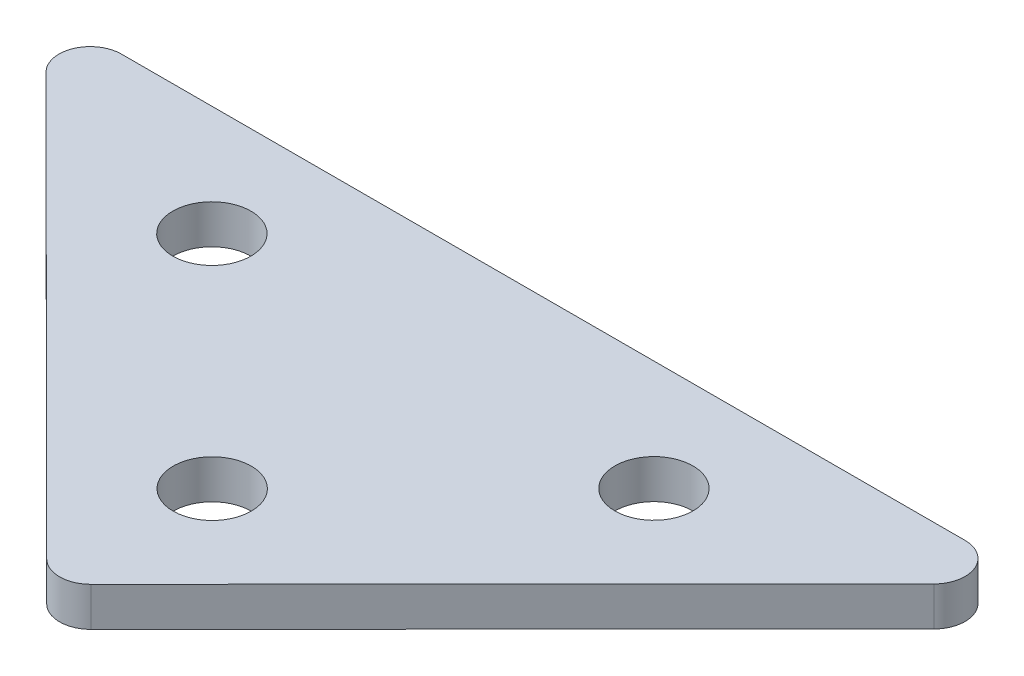
ISO-10303-21;
HEADER;
FILE_DESCRIPTION(('STEP AP214'),'2;1');
FILE_NAME('part.step','',(''),(''),'','','');
FILE_SCHEMA(('AUTOMOTIVE_DESIGN { 1 0 10303 214 1 1 1 1 }'));
ENDSEC;
DATA;
#1=APPLICATION_CONTEXT('core data for automotive mechanical design processes');
#2=APPLICATION_PROTOCOL_DEFINITION('international standard','automotive_design',2000,#1);
#3=PRODUCT_CONTEXT('',#1,'mechanical');
#4=PRODUCT('Part','Part','',(#3));
#5=PRODUCT_RELATED_PRODUCT_CATEGORY('part','',(#4));
#6=PRODUCT_DEFINITION_FORMATION('','',#4);
#7=PRODUCT_DEFINITION_CONTEXT('part definition',#1,'design');
#8=PRODUCT_DEFINITION('design','',#6,#7);
#9=PRODUCT_DEFINITION_SHAPE('','',#8);
#10=(LENGTH_UNIT() NAMED_UNIT(*) SI_UNIT(.MILLI.,.METRE.));
#11=(NAMED_UNIT(*) PLANE_ANGLE_UNIT() SI_UNIT($,.RADIAN.));
#12=(NAMED_UNIT(*) SI_UNIT($,.STERADIAN.) SOLID_ANGLE_UNIT());
#13=UNCERTAINTY_MEASURE_WITH_UNIT(LENGTH_MEASURE(1.E-05),#10,'distance_accuracy_value','');
#14=(GEOMETRIC_REPRESENTATION_CONTEXT(3) GLOBAL_UNCERTAINTY_ASSIGNED_CONTEXT((#13)) GLOBAL_UNIT_ASSIGNED_CONTEXT((#10,
#11,#12)) REPRESENTATION_CONTEXT('',''));
#15=CARTESIAN_POINT('',(0.,0.,0.));
#16=DIRECTION('',(0.,0.,1.));
#17=DIRECTION('',(1.,0.,0.));
#18=AXIS2_PLACEMENT_3D('',#15,#16,#17);
#19=CARTESIAN_POINT('',(141.656172869711,94.6333628767299,304.062793474049));
#20=DIRECTION('',(0.,-1.,0.));
#21=DIRECTION('',(1.,0.,0.));
#22=AXIS2_PLACEMENT_3D('',#19,#20,#21);
#23=PLANE('',#22);
#24=CARTESIAN_POINT('',(141.656172869711,94.6333628767299,304.062793474049));
#25=DIRECTION('',(0.,-1.,0.));
#26=DIRECTION('',(1.,0.,0.));
#27=AXIS2_PLACEMENT_3D('',#24,#25,#26);
#28=CIRCLE('',#27,2.54000000000001);
#29=CARTESIAN_POINT('',(139.861544625665,94.6333628767299,305.860266551921));
#30=VERTEX_POINT('',#29);
#31=CARTESIAN_POINT('',(141.654161268422,94.6333628767299,301.522794270612));
#32=VERTEX_POINT('',#31);
#33=EDGE_CURVE('E122',#30,#32,#28,.T.);
#34=ORIENTED_EDGE('',*,*,#33,.T.);
#35=DIRECTION('',(0.999999686392493,0.,-0.000791969011687206));
#36=VECTOR('',#35,1.);
#37=CARTESIAN_POINT('',(141.654161268422,94.6333628767299,301.522794270612));
#38=LINE('',#37,#36);
#39=CARTESIAN_POINT('',(210.212239960853,94.6333628767299,301.468498379759));
#40=VERTEX_POINT('',#39);
#41=EDGE_CURVE('E125',#32,#40,#38,.T.);
#42=ORIENTED_EDGE('',*,*,#41,.T.);
#43=CARTESIAN_POINT('',(210.214251562143,94.6333628767299,304.008497583196));
#44=DIRECTION('',(0.,1.,0.));
#45=DIRECTION('',(-1.,0.,0.));
#46=AXIS2_PLACEMENT_3D('',#43,#44,#45);
#47=CIRCLE('',#46,2.53999999999998);
#48=CARTESIAN_POINT('',(212.011724640015,94.6333628767299,305.803125827242));
#49=VERTEX_POINT('',#48);
#50=EDGE_CURVE('E129',#49,#40,#47,.T.);
#51=ORIENTED_EDGE('',*,*,#50,.F.);
#52=DIRECTION('',(0.706546552773897,0.,-0.707666566091209));
#53=VECTOR('',#52,1.);
#54=CARTESIAN_POINT('',(177.759833239225,94.6333628767299,340.109313118885));
#55=LINE('',#54,#53);
#56=CARTESIAN_POINT('',(177.759833239225,94.6333628767299,340.109313118885));
#57=VERTEX_POINT('',#56);
#58=EDGE_CURVE('E132',#57,#49,#55,.T.);
#59=ORIENTED_EDGE('',*,*,#58,.F.);
#60=CARTESIAN_POINT('',(175.962360161354,94.6333628767299,338.314684874839));
#61=DIRECTION('',(0.,1.,0.));
#62=DIRECTION('',(-1.,0.,0.));
#63=AXIS2_PLACEMENT_3D('',#60,#61,#62);
#64=CIRCLE('',#63,2.54);
#65=CARTESIAN_POINT('',(174.167731917308,94.6333628767299,340.112157952711));
#66=VERTEX_POINT('',#65);
#67=EDGE_CURVE('E107',#66,#57,#64,.T.);
#68=ORIENTED_EDGE('',*,*,#67,.F.);
#69=DIRECTION('',(-0.707666566091205,0.,-0.706546552773901));
#70=VECTOR('',#69,1.);
#71=CARTESIAN_POINT('',(174.167731917308,94.6333628767299,340.112157952711));
#72=LINE('',#71,#70);
#73=EDGE_CURVE('E135',#66,#30,#72,.T.);
#74=ORIENTED_EDGE('',*,*,#73,.T.);
#75=EDGE_LOOP('',(#34,#42,#51,#59,#68,#74));
#76=FACE_BOUND('',#75,.T.);
#77=CARTESIAN_POINT('',(193.900819308789,94.6333628767299,310.46167546085));
#78=DIRECTION('',(0.,1.,0.));
#79=DIRECTION('',(0.,0.,1.));
#80=AXIS2_PLACEMENT_3D('',#77,#78,#79);
#81=CIRCLE('',#80,3.17499999999998);
#82=CARTESIAN_POINT('',(193.900819308789,94.6333628767299,313.63667546085));
#83=VERTEX_POINT('',#82);
#84=EDGE_CURVE('E126',#83,#83,#81,.T.);
#85=ORIENTED_EDGE('',*,*,#84,.T.);
#86=EDGE_LOOP('',(#85));
#87=FACE_BOUND('',#86,.T.);
#88=CARTESIAN_POINT('',(175.954536868332,94.6333628767299,328.436406239566));
#89=DIRECTION('',(0.,1.,0.));
#90=DIRECTION('',(0.,0.,1.));
#91=AXIS2_PLACEMENT_3D('',#88,#89,#90);
#92=CIRCLE('',#91,3.17499999999998);
#93=CARTESIAN_POINT('',(175.954536868332,94.6333628767299,331.611406239566));
#94=VERTEX_POINT('',#93);
#95=EDGE_CURVE('E188',#94,#94,#92,.T.);
#96=ORIENTED_EDGE('',*,*,#95,.T.);
#97=EDGE_LOOP('',(#96));
#98=FACE_BOUND('',#97,.T.);
#99=CARTESIAN_POINT('',(157.979806089616,94.6333628767299,310.490123799109));
#100=DIRECTION('',(0.,1.,0.));
#101=DIRECTION('',(0.,0.,1.));
#102=AXIS2_PLACEMENT_3D('',#99,#100,#101);
#103=CIRCLE('',#102,3.17499999999998);
#104=CARTESIAN_POINT('',(157.979806089616,94.6333628767299,313.665123799109));
#105=VERTEX_POINT('',#104);
#106=EDGE_CURVE('E178',#105,#105,#103,.T.);
#107=ORIENTED_EDGE('',*,*,#106,.T.);
#108=EDGE_LOOP('',(#107));
#109=FACE_BOUND('',#108,.T.);
#110=ADVANCED_FACE('F37',(#76,#87,#98,#109),#23,.T.);
#111=CARTESIAN_POINT('',(141.656172869711,97.8083628767299,304.062793474049));
#112=DIRECTION('',(0.,-1.,0.));
#113=DIRECTION('',(1.,0.,0.));
#114=AXIS2_PLACEMENT_3D('',#111,#112,#113);
#115=CYLINDRICAL_SURFACE('',#114,2.54000000000001);
#116=ORIENTED_EDGE('',*,*,#33,.F.);
#117=DIRECTION('',(0.,-1.,0.));
#118=VECTOR('',#117,1.);
#119=CARTESIAN_POINT('',(139.861544625665,97.8083628767299,305.860266551921));
#120=LINE('',#119,#118);
#121=CARTESIAN_POINT('',(139.861544625665,97.8083628767299,305.860266551921));
#122=VERTEX_POINT('',#121);
#123=EDGE_CURVE('E11',#122,#30,#120,.T.);
#124=ORIENTED_EDGE('',*,*,#123,.F.);
#125=CARTESIAN_POINT('',(141.656172869711,97.8083628767299,304.062793474049));
#126=DIRECTION('',(0.,-1.,0.));
#127=DIRECTION('',(1.,0.,0.));
#128=AXIS2_PLACEMENT_3D('',#125,#126,#127);
#129=CIRCLE('',#128,2.54000000000001);
#130=CARTESIAN_POINT('',(141.654161268422,97.8083628767299,301.522794270612));
#131=VERTEX_POINT('',#130);
#132=EDGE_CURVE('E137',#122,#131,#129,.T.);
#133=ORIENTED_EDGE('',*,*,#132,.T.);
#134=DIRECTION('',(0.,-1.,0.));
#135=VECTOR('',#134,1.);
#136=CARTESIAN_POINT('',(141.654161268422,97.8083628767299,301.522794270612));
#137=LINE('',#136,#135);
#138=EDGE_CURVE('E41',#131,#32,#137,.T.);
#139=ORIENTED_EDGE('',*,*,#138,.T.);
#140=EDGE_LOOP('',(#116,#124,#133,#139));
#141=FACE_BOUND('',#140,.T.);
#142=ADVANCED_FACE('F39',(#141),#115,.T.);
#143=CARTESIAN_POINT('',(174.167731917308,97.8083628767299,340.112157952711));
#144=DIRECTION('',(-0.7065465527739,0.,0.707666566091205));
#145=DIRECTION('',(0.707666566091205,0.,0.706546552773901));
#146=AXIS2_PLACEMENT_3D('',#143,#144,#145);
#147=PLANE('',#146);
#148=ORIENTED_EDGE('',*,*,#73,.F.);
#149=DIRECTION('',(0.,-1.,0.));
#150=VECTOR('',#149,1.);
#151=CARTESIAN_POINT('',(174.167731917308,97.8083628767299,340.112157952711));
#152=LINE('',#151,#150);
#153=CARTESIAN_POINT('',(174.167731917308,97.8083628767299,340.112157952711));
#154=VERTEX_POINT('',#153);
#155=EDGE_CURVE('E47',#154,#66,#152,.T.);
#156=ORIENTED_EDGE('',*,*,#155,.F.);
#157=DIRECTION('',(-0.707666566091205,0.,-0.706546552773901));
#158=VECTOR('',#157,1.);
#159=CARTESIAN_POINT('',(174.167731917308,97.8083628767299,340.112157952711));
#160=LINE('',#159,#158);
#161=EDGE_CURVE('E102',#154,#122,#160,.T.);
#162=ORIENTED_EDGE('',*,*,#161,.T.);
#163=ORIENTED_EDGE('',*,*,#123,.T.);
#164=EDGE_LOOP('',(#148,#156,#162,#163));
#165=FACE_BOUND('',#164,.T.);
#166=ADVANCED_FACE('F146',(#165),#147,.T.);
#167=CARTESIAN_POINT('',(175.962360161354,97.8083628767299,338.314684874839));
#168=DIRECTION('',(0.,-1.,0.));
#169=DIRECTION('',(1.,0.,0.));
#170=AXIS2_PLACEMENT_3D('',#167,#168,#169);
#171=CYLINDRICAL_SURFACE('',#170,2.54);
#172=ORIENTED_EDGE('',*,*,#67,.T.);
#173=DIRECTION('',(0.,-1.,0.));
#174=VECTOR('',#173,1.);
#175=CARTESIAN_POINT('',(177.759833239225,97.8083628767299,340.109313118885));
#176=LINE('',#175,#174);
#177=CARTESIAN_POINT('',(177.759833239225,97.8083628767299,340.109313118885));
#178=VERTEX_POINT('',#177);
#179=EDGE_CURVE('E105',#178,#57,#176,.T.);
#180=ORIENTED_EDGE('',*,*,#179,.F.);
#181=CARTESIAN_POINT('',(175.962360161354,97.8083628767299,338.314684874839));
#182=DIRECTION('',(0.,1.,0.));
#183=DIRECTION('',(-1.,0.,0.));
#184=AXIS2_PLACEMENT_3D('',#181,#182,#183);
#185=CIRCLE('',#184,2.54);
#186=EDGE_CURVE('E96',#154,#178,#185,.T.);
#187=ORIENTED_EDGE('',*,*,#186,.F.);
#188=ORIENTED_EDGE('',*,*,#155,.T.);
#189=EDGE_LOOP('',(#172,#180,#187,#188));
#190=FACE_BOUND('',#189,.T.);
#191=ADVANCED_FACE('F106',(#190),#171,.T.);
#192=CARTESIAN_POINT('',(177.759833239225,97.8083628767299,340.109313118885));
#193=DIRECTION('',(-0.707666566091209,0.,-0.706546552773896));
#194=DIRECTION('',(-0.706546552773896,0.,0.707666566091209));
#195=AXIS2_PLACEMENT_3D('',#192,#193,#194);
#196=PLANE('',#195);
#197=ORIENTED_EDGE('',*,*,#58,.T.);
#198=DIRECTION('',(0.,-1.,0.));
#199=VECTOR('',#198,1.);
#200=CARTESIAN_POINT('',(212.011724640015,97.8083628767299,305.803125827242));
#201=LINE('',#200,#199);
#202=CARTESIAN_POINT('',(212.011724640015,97.8083628767299,305.803125827242));
#203=VERTEX_POINT('',#202);
#204=EDGE_CURVE('E110',#203,#49,#201,.T.);
#205=ORIENTED_EDGE('',*,*,#204,.F.);
#206=DIRECTION('',(0.706546552773897,0.,-0.707666566091209));
#207=VECTOR('',#206,1.);
#208=CARTESIAN_POINT('',(177.759833239225,97.8083628767299,340.109313118885));
#209=LINE('',#208,#207);
#210=EDGE_CURVE('E100',#178,#203,#209,.T.);
#211=ORIENTED_EDGE('',*,*,#210,.F.);
#212=ORIENTED_EDGE('',*,*,#179,.T.);
#213=EDGE_LOOP('',(#197,#205,#211,#212));
#214=FACE_BOUND('',#213,.T.);
#215=ADVANCED_FACE('F112',(#214),#196,.F.);
#216=CARTESIAN_POINT('',(210.214251562143,97.8083628767299,304.008497583196));
#217=DIRECTION('',(0.,-1.,0.));
#218=DIRECTION('',(1.,0.,0.));
#219=AXIS2_PLACEMENT_3D('',#216,#217,#218);
#220=CYLINDRICAL_SURFACE('',#219,2.53999999999998);
#221=ORIENTED_EDGE('',*,*,#50,.T.);
#222=DIRECTION('',(0.,-1.,0.));
#223=VECTOR('',#222,1.);
#224=CARTESIAN_POINT('',(210.212239960853,97.8083628767299,301.468498379759));
#225=LINE('',#224,#223);
#226=CARTESIAN_POINT('',(210.212239960853,97.8083628767299,301.468498379759));
#227=VERTEX_POINT('',#226);
#228=EDGE_CURVE('E140',#227,#40,#225,.T.);
#229=ORIENTED_EDGE('',*,*,#228,.F.);
#230=CARTESIAN_POINT('',(210.214251562143,97.8083628767299,304.008497583196));
#231=DIRECTION('',(0.,1.,0.));
#232=DIRECTION('',(-1.,0.,0.));
#233=AXIS2_PLACEMENT_3D('',#230,#231,#232);
#234=CIRCLE('',#233,2.53999999999998);
#235=EDGE_CURVE('E115',#203,#227,#234,.T.);
#236=ORIENTED_EDGE('',*,*,#235,.F.);
#237=ORIENTED_EDGE('',*,*,#204,.T.);
#238=EDGE_LOOP('',(#221,#229,#236,#237));
#239=FACE_BOUND('',#238,.T.);
#240=ADVANCED_FACE('F197',(#239),#220,.T.);
#241=CARTESIAN_POINT('',(141.654161268422,97.8083628767299,301.522794270612));
#242=DIRECTION('',(-0.000791969011687206,0.,-0.999999686392493));
#243=DIRECTION('',(-0.999999686392493,0.,0.000791969011687206));
#244=AXIS2_PLACEMENT_3D('',#241,#242,#243);
#245=PLANE('',#244);
#246=ORIENTED_EDGE('',*,*,#41,.F.);
#247=ORIENTED_EDGE('',*,*,#138,.F.);
#248=DIRECTION('',(0.999999686392493,0.,-0.000791969011687206));
#249=VECTOR('',#248,1.);
#250=CARTESIAN_POINT('',(141.654161268422,97.8083628767299,301.522794270612));
#251=LINE('',#250,#249);
#252=EDGE_CURVE('E117',#131,#227,#251,.T.);
#253=ORIENTED_EDGE('',*,*,#252,.T.);
#254=ORIENTED_EDGE('',*,*,#228,.T.);
#255=EDGE_LOOP('',(#246,#247,#253,#254));
#256=FACE_BOUND('',#255,.T.);
#257=ADVANCED_FACE('F142',(#256),#245,.T.);
#258=CARTESIAN_POINT('',(141.656172869711,97.8083628767299,304.062793474049));
#259=DIRECTION('',(0.,-1.,0.));
#260=DIRECTION('',(1.,0.,0.));
#261=AXIS2_PLACEMENT_3D('',#258,#259,#260);
#262=PLANE('',#261);
#263=CARTESIAN_POINT('',(157.979806089616,97.8083628767299,310.490123799109));
#264=DIRECTION('',(0.,1.,0.));
#265=DIRECTION('',(0.,0.,1.));
#266=AXIS2_PLACEMENT_3D('',#263,#264,#265);
#267=CIRCLE('',#266,3.17499999999998);
#268=CARTESIAN_POINT('',(157.979806089616,97.8083628767299,313.665123799109));
#269=VERTEX_POINT('',#268);
#270=EDGE_CURVE('E181',#269,#269,#267,.T.);
#271=ORIENTED_EDGE('',*,*,#270,.F.);
#272=EDGE_LOOP('',(#271));
#273=FACE_BOUND('',#272,.T.);
#274=CARTESIAN_POINT('',(175.954536868332,97.8083628767299,328.436406239566));
#275=DIRECTION('',(0.,1.,0.));
#276=DIRECTION('',(0.,0.,1.));
#277=AXIS2_PLACEMENT_3D('',#274,#275,#276);
#278=CIRCLE('',#277,3.17499999999998);
#279=CARTESIAN_POINT('',(175.954536868332,97.8083628767299,331.611406239566));
#280=VERTEX_POINT('',#279);
#281=EDGE_CURVE('E183',#280,#280,#278,.T.);
#282=ORIENTED_EDGE('',*,*,#281,.F.);
#283=EDGE_LOOP('',(#282));
#284=FACE_BOUND('',#283,.T.);
#285=CARTESIAN_POINT('',(193.900819308789,97.8083628767299,310.46167546085));
#286=DIRECTION('',(0.,1.,0.));
#287=DIRECTION('',(0.,0.,1.));
#288=AXIS2_PLACEMENT_3D('',#285,#286,#287);
#289=CIRCLE('',#288,3.17499999999998);
#290=CARTESIAN_POINT('',(193.900819308789,97.8083628767299,313.63667546085));
#291=VERTEX_POINT('',#290);
#292=EDGE_CURVE('E191',#291,#291,#289,.T.);
#293=ORIENTED_EDGE('',*,*,#292,.F.);
#294=EDGE_LOOP('',(#293));
#295=FACE_BOUND('',#294,.T.);
#296=ORIENTED_EDGE('',*,*,#132,.F.);
#297=ORIENTED_EDGE('',*,*,#161,.F.);
#298=ORIENTED_EDGE('',*,*,#186,.T.);
#299=ORIENTED_EDGE('',*,*,#210,.T.);
#300=ORIENTED_EDGE('',*,*,#235,.T.);
#301=ORIENTED_EDGE('',*,*,#252,.F.);
#302=EDGE_LOOP('',(#296,#297,#298,#299,#300,#301));
#303=FACE_BOUND('',#302,.T.);
#304=ADVANCED_FACE('F98',(#273,#284,#295,#303),#262,.F.);
#305=CARTESIAN_POINT('',(193.900819308789,97.8083628767299,310.46167546085));
#306=DIRECTION('',(0.,1.,0.));
#307=DIRECTION('',(0.,0.,1.));
#308=AXIS2_PLACEMENT_3D('',#305,#306,#307);
#309=CYLINDRICAL_SURFACE('',#308,3.17499999999998);
#310=ORIENTED_EDGE('',*,*,#84,.F.);
#311=EDGE_LOOP('',(#310));
#312=FACE_BOUND('',#311,.T.);
#313=ORIENTED_EDGE('',*,*,#292,.T.);
#314=EDGE_LOOP('',(#313));
#315=FACE_BOUND('',#314,.T.);
#316=ADVANCED_FACE('F161',(#312,#315),#309,.F.);
#317=CARTESIAN_POINT('',(175.954536868332,97.8083628767299,328.436406239566));
#318=DIRECTION('',(0.,1.,0.));
#319=DIRECTION('',(0.,0.,1.));
#320=AXIS2_PLACEMENT_3D('',#317,#318,#319);
#321=CYLINDRICAL_SURFACE('',#320,3.17499999999998);
#322=ORIENTED_EDGE('',*,*,#95,.F.);
#323=EDGE_LOOP('',(#322));
#324=FACE_BOUND('',#323,.T.);
#325=ORIENTED_EDGE('',*,*,#281,.T.);
#326=EDGE_LOOP('',(#325));
#327=FACE_BOUND('',#326,.T.);
#328=ADVANCED_FACE('F165',(#324,#327),#321,.F.);
#329=CARTESIAN_POINT('',(157.979806089616,97.8083628767299,310.490123799109));
#330=DIRECTION('',(0.,1.,0.));
#331=DIRECTION('',(0.,0.,1.));
#332=AXIS2_PLACEMENT_3D('',#329,#330,#331);
#333=CYLINDRICAL_SURFACE('',#332,3.17499999999998);
#334=ORIENTED_EDGE('',*,*,#106,.F.);
#335=EDGE_LOOP('',(#334));
#336=FACE_BOUND('',#335,.T.);
#337=ORIENTED_EDGE('',*,*,#270,.T.);
#338=EDGE_LOOP('',(#337));
#339=FACE_BOUND('',#338,.T.);
#340=ADVANCED_FACE('F169',(#336,#339),#333,.F.);
#341=CLOSED_SHELL('',(#110,#142,#166,#191,#215,#240,#257,#304,#316,#328,#340));
#342=MANIFOLD_SOLID_BREP('B2',#341);
#343=ADVANCED_BREP_SHAPE_REPRESENTATION('',(#18,#342),#14);
#344=SHAPE_DEFINITION_REPRESENTATION(#9,#343);
ENDSEC;
END-ISO-10303-21;
